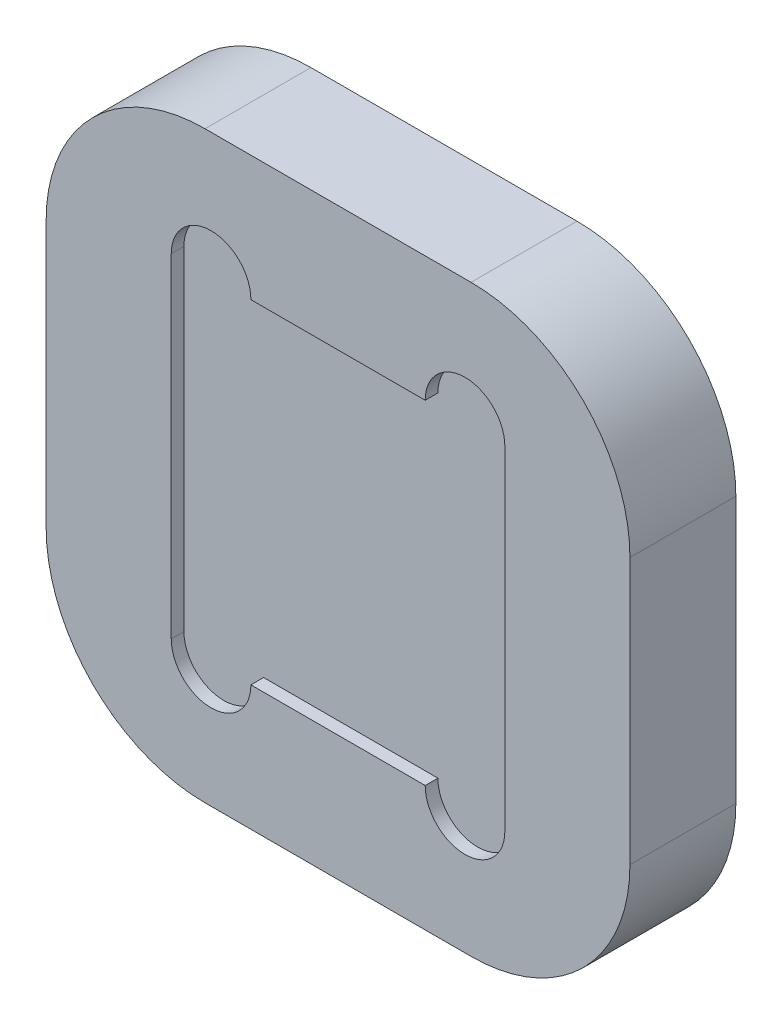
ISO-10303-21;
HEADER;
FILE_DESCRIPTION(('STEP AP214'),'2;1');
FILE_NAME('part.step','',(''),(''),'','','');
FILE_SCHEMA(('AUTOMOTIVE_DESIGN { 1 0 10303 214 1 1 1 1 }'));
ENDSEC;
DATA;
#1=APPLICATION_CONTEXT('core data for automotive mechanical design processes');
#2=APPLICATION_PROTOCOL_DEFINITION('international standard','automotive_design',2000,#1);
#3=PRODUCT_CONTEXT('',#1,'mechanical');
#4=PRODUCT('Part','Part','',(#3));
#5=PRODUCT_RELATED_PRODUCT_CATEGORY('part','',(#4));
#6=PRODUCT_DEFINITION_FORMATION('','',#4);
#7=PRODUCT_DEFINITION_CONTEXT('part definition',#1,'design');
#8=PRODUCT_DEFINITION('design','',#6,#7);
#9=PRODUCT_DEFINITION_SHAPE('','',#8);
#10=(LENGTH_UNIT() NAMED_UNIT(*) SI_UNIT(.MILLI.,.METRE.));
#11=(NAMED_UNIT(*) PLANE_ANGLE_UNIT() SI_UNIT($,.RADIAN.));
#12=(NAMED_UNIT(*) SI_UNIT($,.STERADIAN.) SOLID_ANGLE_UNIT());
#13=UNCERTAINTY_MEASURE_WITH_UNIT(LENGTH_MEASURE(1.E-05),#10,'distance_accuracy_value','');
#14=(GEOMETRIC_REPRESENTATION_CONTEXT(3) GLOBAL_UNCERTAINTY_ASSIGNED_CONTEXT((#13)) GLOBAL_UNIT_ASSIGNED_CONTEXT((#10,
#11,#12)) REPRESENTATION_CONTEXT('',''));
#15=CARTESIAN_POINT('',(0.,0.,0.));
#16=DIRECTION('',(0.,0.,1.));
#17=DIRECTION('',(1.,0.,0.));
#18=AXIS2_PLACEMENT_3D('',#15,#16,#17);
#19=CARTESIAN_POINT('',(17.5,17.5,6.35));
#20=DIRECTION('',(-1.,0.,0.));
#21=DIRECTION('',(0.,-1.,0.));
#22=AXIS2_PLACEMENT_3D('',#19,#20,#21);
#23=PLANE('',#22);
#24=DIRECTION('',(0.,1.,0.));
#25=VECTOR('',#24,1.);
#26=CARTESIAN_POINT('',(17.5,17.5,0.));
#27=LINE('',#26,#25);
#28=CARTESIAN_POINT('',(17.5,-7.97500000000001,0.));
#29=VERTEX_POINT('',#28);
#30=CARTESIAN_POINT('',(17.5,7.975,0.));
#31=VERTEX_POINT('',#30);
#32=EDGE_CURVE('E210',#29,#31,#27,.T.);
#33=ORIENTED_EDGE('',*,*,#32,.T.);
#34=DIRECTION('',(0.,0.,-1.));
#35=VECTOR('',#34,1.);
#36=CARTESIAN_POINT('',(17.5,7.975,6.35));
#37=LINE('',#36,#35);
#38=CARTESIAN_POINT('',(17.5,7.975,6.35));
#39=VERTEX_POINT('',#38);
#40=EDGE_CURVE('E258',#31,#39,#37,.F.);
#41=ORIENTED_EDGE('',*,*,#40,.T.);
#42=DIRECTION('',(0.,1.,0.));
#43=VECTOR('',#42,1.);
#44=CARTESIAN_POINT('',(17.5,17.5,6.35));
#45=LINE('',#44,#43);
#46=CARTESIAN_POINT('',(17.5,-7.97500000000001,6.35));
#47=VERTEX_POINT('',#46);
#48=EDGE_CURVE('E222',#47,#39,#45,.T.);
#49=ORIENTED_EDGE('',*,*,#48,.F.);
#50=DIRECTION('',(0.,0.,-1.));
#51=VECTOR('',#50,1.);
#52=CARTESIAN_POINT('',(17.5,-7.97500000000001,6.35));
#53=LINE('',#52,#51);
#54=EDGE_CURVE('E255',#47,#29,#53,.T.);
#55=ORIENTED_EDGE('',*,*,#54,.T.);
#56=EDGE_LOOP('',(#33,#41,#49,#55));
#57=FACE_BOUND('',#56,.T.);
#58=ADVANCED_FACE('F32',(#57),#23,.F.);
#59=CARTESIAN_POINT('',(-17.5,17.5,6.35));
#60=DIRECTION('',(0.,-1.,0.));
#61=DIRECTION('',(0.,0.,-1.));
#62=AXIS2_PLACEMENT_3D('',#59,#60,#61);
#63=PLANE('',#62);
#64=DIRECTION('',(-1.,0.,0.));
#65=VECTOR('',#64,1.);
#66=CARTESIAN_POINT('',(-17.5,17.5,6.35));
#67=LINE('',#66,#65);
#68=CARTESIAN_POINT('',(7.975,17.5,6.35));
#69=VERTEX_POINT('',#68);
#70=CARTESIAN_POINT('',(-7.975,17.5,6.35));
#71=VERTEX_POINT('',#70);
#72=EDGE_CURVE('E225',#69,#71,#67,.T.);
#73=ORIENTED_EDGE('',*,*,#72,.F.);
#74=DIRECTION('',(0.,0.,-1.));
#75=VECTOR('',#74,1.);
#76=CARTESIAN_POINT('',(7.975,17.5,6.35));
#77=LINE('',#76,#75);
#78=CARTESIAN_POINT('',(7.975,17.5,0.));
#79=VERTEX_POINT('',#78);
#80=EDGE_CURVE('E244',#69,#79,#77,.T.);
#81=ORIENTED_EDGE('',*,*,#80,.T.);
#82=DIRECTION('',(-1.,0.,0.));
#83=VECTOR('',#82,1.);
#84=CARTESIAN_POINT('',(-17.5,17.5,0.));
#85=LINE('',#84,#83);
#86=CARTESIAN_POINT('',(-7.975,17.5,0.));
#87=VERTEX_POINT('',#86);
#88=EDGE_CURVE('E236',#79,#87,#85,.T.);
#89=ORIENTED_EDGE('',*,*,#88,.T.);
#90=DIRECTION('',(0.,0.,-1.));
#91=VECTOR('',#90,1.);
#92=CARTESIAN_POINT('',(-7.975,17.5,6.35));
#93=LINE('',#92,#91);
#94=EDGE_CURVE('E233',#87,#71,#93,.F.);
#95=ORIENTED_EDGE('',*,*,#94,.T.);
#96=EDGE_LOOP('',(#73,#81,#89,#95));
#97=FACE_BOUND('',#96,.T.);
#98=ADVANCED_FACE('F299',(#97),#63,.F.);
#99=CARTESIAN_POINT('',(-17.5,17.5,6.35));
#100=DIRECTION('',(1.,0.,0.));
#101=DIRECTION('',(0.,0.,-1.));
#102=AXIS2_PLACEMENT_3D('',#99,#100,#101);
#103=PLANE('',#102);
#104=DIRECTION('',(0.,-1.,0.));
#105=VECTOR('',#104,1.);
#106=CARTESIAN_POINT('',(-17.5,17.5,6.35));
#107=LINE('',#106,#105);
#108=CARTESIAN_POINT('',(-17.5,7.97499999999999,6.35));
#109=VERTEX_POINT('',#108);
#110=CARTESIAN_POINT('',(-17.5,-7.97500000000001,6.35));
#111=VERTEX_POINT('',#110);
#112=EDGE_CURVE('E229',#109,#111,#107,.T.);
#113=ORIENTED_EDGE('',*,*,#112,.F.);
#114=DIRECTION('',(0.,0.,-1.));
#115=VECTOR('',#114,1.);
#116=CARTESIAN_POINT('',(-17.5,7.97499999999999,6.35));
#117=LINE('',#116,#115);
#118=CARTESIAN_POINT('',(-17.5,7.97499999999999,0.));
#119=VERTEX_POINT('',#118);
#120=EDGE_CURVE('E11',#109,#119,#117,.T.);
#121=ORIENTED_EDGE('',*,*,#120,.T.);
#122=DIRECTION('',(0.,-1.,0.));
#123=VECTOR('',#122,1.);
#124=CARTESIAN_POINT('',(-17.5,17.5,0.));
#125=LINE('',#124,#123);
#126=CARTESIAN_POINT('',(-17.5,-7.97500000000001,0.));
#127=VERTEX_POINT('',#126);
#128=EDGE_CURVE('E239',#119,#127,#125,.T.);
#129=ORIENTED_EDGE('',*,*,#128,.T.);
#130=DIRECTION('',(0.,0.,-1.));
#131=VECTOR('',#130,1.);
#132=CARTESIAN_POINT('',(-17.5,-7.97500000000001,6.35));
#133=LINE('',#132,#131);
#134=EDGE_CURVE('E40',#127,#111,#133,.F.);
#135=ORIENTED_EDGE('',*,*,#134,.T.);
#136=EDGE_LOOP('',(#113,#121,#129,#135));
#137=FACE_BOUND('',#136,.T.);
#138=ADVANCED_FACE('F273',(#137),#103,.F.);
#139=CARTESIAN_POINT('',(-17.5,-17.5,6.35));
#140=DIRECTION('',(0.,1.,0.));
#141=DIRECTION('',(0.,0.,1.));
#142=AXIS2_PLACEMENT_3D('',#139,#140,#141);
#143=PLANE('',#142);
#144=DIRECTION('',(1.,0.,0.));
#145=VECTOR('',#144,1.);
#146=CARTESIAN_POINT('',(-17.5,-17.5,0.));
#147=LINE('',#146,#145);
#148=CARTESIAN_POINT('',(-7.975,-17.5,0.));
#149=VERTEX_POINT('',#148);
#150=CARTESIAN_POINT('',(7.975,-17.5,0.));
#151=VERTEX_POINT('',#150);
#152=EDGE_CURVE('E226',#149,#151,#147,.T.);
#153=ORIENTED_EDGE('',*,*,#152,.T.);
#154=DIRECTION('',(0.,0.,-1.));
#155=VECTOR('',#154,1.);
#156=CARTESIAN_POINT('',(7.975,-17.5,6.35));
#157=LINE('',#156,#155);
#158=CARTESIAN_POINT('',(7.975,-17.5,6.35));
#159=VERTEX_POINT('',#158);
#160=EDGE_CURVE('E47',#151,#159,#157,.F.);
#161=ORIENTED_EDGE('',*,*,#160,.T.);
#162=DIRECTION('',(1.,0.,0.));
#163=VECTOR('',#162,1.);
#164=CARTESIAN_POINT('',(-17.5,-17.5,6.35));
#165=LINE('',#164,#163);
#166=CARTESIAN_POINT('',(-7.975,-17.5,6.35));
#167=VERTEX_POINT('',#166);
#168=EDGE_CURVE('E231',#167,#159,#165,.T.);
#169=ORIENTED_EDGE('',*,*,#168,.F.);
#170=DIRECTION('',(0.,0.,-1.));
#171=VECTOR('',#170,1.);
#172=CARTESIAN_POINT('',(-7.975,-17.5,6.35));
#173=LINE('',#172,#171);
#174=EDGE_CURVE('E267',#167,#149,#173,.T.);
#175=ORIENTED_EDGE('',*,*,#174,.T.);
#176=EDGE_LOOP('',(#153,#161,#169,#175));
#177=FACE_BOUND('',#176,.T.);
#178=ADVANCED_FACE('F281',(#177),#143,.F.);
#179=CARTESIAN_POINT('',(0.,0.,6.35));
#180=DIRECTION('',(0.,0.,1.));
#181=DIRECTION('',(1.,0.,0.));
#182=AXIS2_PLACEMENT_3D('',#179,#180,#181);
#183=PLANE('',#182);
#184=CARTESIAN_POINT('',(-7.61239999999999,10.,6.35));
#185=DIRECTION('',(0.,0.,1.));
#186=DIRECTION('',(1.,0.,0.));
#187=AXIS2_PLACEMENT_3D('',#184,#185,#186);
#188=CIRCLE('',#187,2.3876);
#189=CARTESIAN_POINT('',(-5.22479999999999,10.,6.35));
#190=VERTEX_POINT('',#189);
#191=CARTESIAN_POINT('',(-10.,10.,6.35));
#192=VERTEX_POINT('',#191);
#193=EDGE_CURVE('E154',#190,#192,#188,.T.);
#194=ORIENTED_EDGE('',*,*,#193,.F.);
#195=DIRECTION('',(-1.,0.,0.));
#196=VECTOR('',#195,1.);
#197=CARTESIAN_POINT('',(-5.22479999999999,10.,6.35));
#198=LINE('',#197,#196);
#199=CARTESIAN_POINT('',(5.2248,10.,6.35));
#200=VERTEX_POINT('',#199);
#201=EDGE_CURVE('E172',#200,#190,#198,.T.);
#202=ORIENTED_EDGE('',*,*,#201,.F.);
#203=CARTESIAN_POINT('',(7.6124,10.,6.35));
#204=DIRECTION('',(0.,0.,1.));
#205=DIRECTION('',(1.,0.,0.));
#206=AXIS2_PLACEMENT_3D('',#203,#204,#205);
#207=CIRCLE('',#206,2.3876);
#208=CARTESIAN_POINT('',(10.,10.,6.35));
#209=VERTEX_POINT('',#208);
#210=EDGE_CURVE('E175',#209,#200,#207,.T.);
#211=ORIENTED_EDGE('',*,*,#210,.F.);
#212=DIRECTION('',(0.,1.,0.));
#213=VECTOR('',#212,1.);
#214=CARTESIAN_POINT('',(10.,10.,6.35));
#215=LINE('',#214,#213);
#216=CARTESIAN_POINT('',(10.,-10.,6.35));
#217=VERTEX_POINT('',#216);
#218=EDGE_CURVE('E203',#217,#209,#215,.T.);
#219=ORIENTED_EDGE('',*,*,#218,.F.);
#220=CARTESIAN_POINT('',(7.6124,-10.,6.35));
#221=DIRECTION('',(0.,0.,1.));
#222=DIRECTION('',(1.,0.,0.));
#223=AXIS2_PLACEMENT_3D('',#220,#221,#222);
#224=CIRCLE('',#223,2.3876);
#225=CARTESIAN_POINT('',(5.2248,-10.,6.35));
#226=VERTEX_POINT('',#225);
#227=EDGE_CURVE('E200',#226,#217,#224,.T.);
#228=ORIENTED_EDGE('',*,*,#227,.F.);
#229=DIRECTION('',(1.,0.,0.));
#230=VECTOR('',#229,1.);
#231=CARTESIAN_POINT('',(-5.22479999999999,-10.,6.35));
#232=LINE('',#231,#230);
#233=CARTESIAN_POINT('',(-5.22479999999999,-10.,6.35));
#234=VERTEX_POINT('',#233);
#235=EDGE_CURVE('E197',#234,#226,#232,.T.);
#236=ORIENTED_EDGE('',*,*,#235,.F.);
#237=CARTESIAN_POINT('',(-7.61239999999999,-10.,6.35));
#238=DIRECTION('',(0.,0.,1.));
#239=DIRECTION('',(1.,0.,0.));
#240=AXIS2_PLACEMENT_3D('',#237,#238,#239);
#241=CIRCLE('',#240,2.3876);
#242=CARTESIAN_POINT('',(-10.,-10.,6.35));
#243=VERTEX_POINT('',#242);
#244=EDGE_CURVE('E194',#243,#234,#241,.T.);
#245=ORIENTED_EDGE('',*,*,#244,.F.);
#246=DIRECTION('',(0.,-1.,0.));
#247=VECTOR('',#246,1.);
#248=CARTESIAN_POINT('',(-10.,10.,6.35));
#249=LINE('',#248,#247);
#250=EDGE_CURVE('E192',#192,#243,#249,.T.);
#251=ORIENTED_EDGE('',*,*,#250,.F.);
#252=EDGE_LOOP('',(#194,#202,#211,#219,#228,#236,#245,#251));
#253=FACE_BOUND('',#252,.T.);
#254=ORIENTED_EDGE('',*,*,#48,.T.);
#255=CARTESIAN_POINT('',(7.975,7.97499999999999,6.35));
#256=DIRECTION('',(0.,0.,1.));
#257=DIRECTION('',(1.,0.,0.));
#258=AXIS2_PLACEMENT_3D('',#255,#256,#257);
#259=CIRCLE('',#258,9.525);
#260=EDGE_CURVE('E265',#39,#69,#259,.T.);
#261=ORIENTED_EDGE('',*,*,#260,.T.);
#262=ORIENTED_EDGE('',*,*,#72,.T.);
#263=CARTESIAN_POINT('',(-7.975,7.97499999999999,6.35));
#264=DIRECTION('',(0.,0.,1.));
#265=DIRECTION('',(1.,0.,0.));
#266=AXIS2_PLACEMENT_3D('',#263,#264,#265);
#267=CIRCLE('',#266,9.525);
#268=EDGE_CURVE('E261',#71,#109,#267,.T.);
#269=ORIENTED_EDGE('',*,*,#268,.T.);
#270=ORIENTED_EDGE('',*,*,#112,.T.);
#271=CARTESIAN_POINT('',(-7.975,-7.97500000000001,6.35));
#272=DIRECTION('',(0.,0.,1.));
#273=DIRECTION('',(1.,0.,0.));
#274=AXIS2_PLACEMENT_3D('',#271,#272,#273);
#275=CIRCLE('',#274,9.525);
#276=EDGE_CURVE('E54',#111,#167,#275,.T.);
#277=ORIENTED_EDGE('',*,*,#276,.T.);
#278=ORIENTED_EDGE('',*,*,#168,.T.);
#279=CARTESIAN_POINT('',(7.975,-7.97500000000001,6.35));
#280=DIRECTION('',(0.,0.,1.));
#281=DIRECTION('',(1.,0.,0.));
#282=AXIS2_PLACEMENT_3D('',#279,#280,#281);
#283=CIRCLE('',#282,9.525);
#284=EDGE_CURVE('E263',#159,#47,#283,.T.);
#285=ORIENTED_EDGE('',*,*,#284,.T.);
#286=EDGE_LOOP('',(#254,#261,#262,#269,#270,#277,#278,#285));
#287=FACE_BOUND('',#286,.T.);
#288=ADVANCED_FACE('F277',(#253,#287),#183,.T.);
#289=CARTESIAN_POINT('',(0.,0.,0.));
#290=DIRECTION('',(0.,0.,1.));
#291=DIRECTION('',(1.,0.,0.));
#292=AXIS2_PLACEMENT_3D('',#289,#290,#291);
#293=PLANE('',#292);
#294=ORIENTED_EDGE('',*,*,#88,.F.);
#295=CARTESIAN_POINT('',(7.975,7.97499999999999,0.));
#296=DIRECTION('',(0.,0.,1.));
#297=DIRECTION('',(1.,0.,0.));
#298=AXIS2_PLACEMENT_3D('',#295,#296,#297);
#299=CIRCLE('',#298,9.525);
#300=EDGE_CURVE('E253',#79,#31,#299,.F.);
#301=ORIENTED_EDGE('',*,*,#300,.T.);
#302=ORIENTED_EDGE('',*,*,#32,.F.);
#303=CARTESIAN_POINT('',(7.975,-7.97500000000001,0.));
#304=DIRECTION('',(0.,0.,1.));
#305=DIRECTION('',(1.,0.,0.));
#306=AXIS2_PLACEMENT_3D('',#303,#304,#305);
#307=CIRCLE('',#306,9.525);
#308=EDGE_CURVE('E251',#29,#151,#307,.F.);
#309=ORIENTED_EDGE('',*,*,#308,.T.);
#310=ORIENTED_EDGE('',*,*,#152,.F.);
#311=CARTESIAN_POINT('',(-7.975,-7.97500000000001,0.));
#312=DIRECTION('',(0.,0.,1.));
#313=DIRECTION('',(1.,0.,0.));
#314=AXIS2_PLACEMENT_3D('',#311,#312,#313);
#315=CIRCLE('',#314,9.525);
#316=EDGE_CURVE('E247',#149,#127,#315,.F.);
#317=ORIENTED_EDGE('',*,*,#316,.T.);
#318=ORIENTED_EDGE('',*,*,#128,.F.);
#319=CARTESIAN_POINT('',(-7.975,7.97499999999999,0.));
#320=DIRECTION('',(0.,0.,1.));
#321=DIRECTION('',(1.,0.,0.));
#322=AXIS2_PLACEMENT_3D('',#319,#320,#321);
#323=CIRCLE('',#322,9.525);
#324=EDGE_CURVE('E249',#119,#87,#323,.F.);
#325=ORIENTED_EDGE('',*,*,#324,.T.);
#326=EDGE_LOOP('',(#294,#301,#302,#309,#310,#317,#318,#325));
#327=FACE_BOUND('',#326,.T.);
#328=ADVANCED_FACE('F284',(#327),#293,.F.);
#329=CARTESIAN_POINT('',(-7.61239999999999,10.,5.588));
#330=DIRECTION('',(0.,0.,1.));
#331=DIRECTION('',(1.,0.,0.));
#332=AXIS2_PLACEMENT_3D('',#329,#330,#331);
#333=CYLINDRICAL_SURFACE('',#332,2.3876);
#334=ORIENTED_EDGE('',*,*,#193,.T.);
#335=DIRECTION('',(0.,0.,1.));
#336=VECTOR('',#335,1.);
#337=CARTESIAN_POINT('',(-10.,10.,5.588));
#338=LINE('',#337,#336);
#339=CARTESIAN_POINT('',(-10.,10.,5.588));
#340=VERTEX_POINT('',#339);
#341=EDGE_CURVE('E147',#340,#192,#338,.T.);
#342=ORIENTED_EDGE('',*,*,#341,.F.);
#343=CARTESIAN_POINT('',(-7.61239999999999,10.,5.588));
#344=DIRECTION('',(0.,0.,1.));
#345=DIRECTION('',(1.,0.,0.));
#346=AXIS2_PLACEMENT_3D('',#343,#344,#345);
#347=CIRCLE('',#346,2.3876);
#348=CARTESIAN_POINT('',(-5.22479999999999,10.,5.588));
#349=VERTEX_POINT('',#348);
#350=EDGE_CURVE('E151',#349,#340,#347,.T.);
#351=ORIENTED_EDGE('',*,*,#350,.F.);
#352=DIRECTION('',(0.,0.,1.));
#353=VECTOR('',#352,1.);
#354=CARTESIAN_POINT('',(-5.22479999999999,10.,5.588));
#355=LINE('',#354,#353);
#356=EDGE_CURVE('E208',#349,#190,#355,.T.);
#357=ORIENTED_EDGE('',*,*,#356,.T.);
#358=EDGE_LOOP('',(#334,#342,#351,#357));
#359=FACE_BOUND('',#358,.T.);
#360=ADVANCED_FACE('F149',(#359),#333,.F.);
#361=CARTESIAN_POINT('',(-5.22479999999999,10.,5.588));
#362=DIRECTION('',(0.,1.,0.));
#363=DIRECTION('',(0.,0.,1.));
#364=AXIS2_PLACEMENT_3D('',#361,#362,#363);
#365=PLANE('',#364);
#366=ORIENTED_EDGE('',*,*,#201,.T.);
#367=ORIENTED_EDGE('',*,*,#356,.F.);
#368=DIRECTION('',(-1.,0.,0.));
#369=VECTOR('',#368,1.);
#370=CARTESIAN_POINT('',(-5.22479999999999,10.,5.588));
#371=LINE('',#370,#369);
#372=CARTESIAN_POINT('',(5.2248,10.,5.588));
#373=VERTEX_POINT('',#372);
#374=EDGE_CURVE('E159',#373,#349,#371,.T.);
#375=ORIENTED_EDGE('',*,*,#374,.F.);
#376=DIRECTION('',(0.,0.,1.));
#377=VECTOR('',#376,1.);
#378=CARTESIAN_POINT('',(5.2248,10.,5.588));
#379=LINE('',#378,#377);
#380=EDGE_CURVE('E211',#373,#200,#379,.T.);
#381=ORIENTED_EDGE('',*,*,#380,.T.);
#382=EDGE_LOOP('',(#366,#367,#375,#381));
#383=FACE_BOUND('',#382,.T.);
#384=ADVANCED_FACE('F328',(#383),#365,.F.);
#385=CARTESIAN_POINT('',(7.6124,10.,5.588));
#386=DIRECTION('',(0.,0.,1.));
#387=DIRECTION('',(1.,0.,0.));
#388=AXIS2_PLACEMENT_3D('',#385,#386,#387);
#389=CYLINDRICAL_SURFACE('',#388,2.3876);
#390=ORIENTED_EDGE('',*,*,#210,.T.);
#391=ORIENTED_EDGE('',*,*,#380,.F.);
#392=CARTESIAN_POINT('',(7.6124,10.,5.588));
#393=DIRECTION('',(0.,0.,1.));
#394=DIRECTION('',(1.,0.,0.));
#395=AXIS2_PLACEMENT_3D('',#392,#393,#394);
#396=CIRCLE('',#395,2.3876);
#397=CARTESIAN_POINT('',(10.,10.,5.588));
#398=VERTEX_POINT('',#397);
#399=EDGE_CURVE('E188',#398,#373,#396,.T.);
#400=ORIENTED_EDGE('',*,*,#399,.F.);
#401=DIRECTION('',(0.,0.,1.));
#402=VECTOR('',#401,1.);
#403=CARTESIAN_POINT('',(10.,10.,5.588));
#404=LINE('',#403,#402);
#405=EDGE_CURVE('E213',#398,#209,#404,.T.);
#406=ORIENTED_EDGE('',*,*,#405,.T.);
#407=EDGE_LOOP('',(#390,#391,#400,#406));
#408=FACE_BOUND('',#407,.T.);
#409=ADVANCED_FACE('F331',(#408),#389,.F.);
#410=CARTESIAN_POINT('',(10.,10.,5.588));
#411=DIRECTION('',(1.,0.,0.));
#412=DIRECTION('',(0.,1.,0.));
#413=AXIS2_PLACEMENT_3D('',#410,#411,#412);
#414=PLANE('',#413);
#415=ORIENTED_EDGE('',*,*,#218,.T.);
#416=ORIENTED_EDGE('',*,*,#405,.F.);
#417=DIRECTION('',(0.,1.,0.));
#418=VECTOR('',#417,1.);
#419=CARTESIAN_POINT('',(10.,10.,5.588));
#420=LINE('',#419,#418);
#421=CARTESIAN_POINT('',(10.,-10.,5.588));
#422=VERTEX_POINT('',#421);
#423=EDGE_CURVE('E185',#422,#398,#420,.T.);
#424=ORIENTED_EDGE('',*,*,#423,.F.);
#425=DIRECTION('',(0.,0.,1.));
#426=VECTOR('',#425,1.);
#427=CARTESIAN_POINT('',(10.,-10.,5.588));
#428=LINE('',#427,#426);
#429=EDGE_CURVE('E215',#422,#217,#428,.T.);
#430=ORIENTED_EDGE('',*,*,#429,.T.);
#431=EDGE_LOOP('',(#415,#416,#424,#430));
#432=FACE_BOUND('',#431,.T.);
#433=ADVANCED_FACE('F335',(#432),#414,.F.);
#434=CARTESIAN_POINT('',(7.6124,-10.,5.588));
#435=DIRECTION('',(0.,0.,1.));
#436=DIRECTION('',(1.,0.,0.));
#437=AXIS2_PLACEMENT_3D('',#434,#435,#436);
#438=CYLINDRICAL_SURFACE('',#437,2.3876);
#439=ORIENTED_EDGE('',*,*,#227,.T.);
#440=ORIENTED_EDGE('',*,*,#429,.F.);
#441=CARTESIAN_POINT('',(7.6124,-10.,5.588));
#442=DIRECTION('',(0.,0.,1.));
#443=DIRECTION('',(1.,0.,0.));
#444=AXIS2_PLACEMENT_3D('',#441,#442,#443);
#445=CIRCLE('',#444,2.3876);
#446=CARTESIAN_POINT('',(5.2248,-10.,5.588));
#447=VERTEX_POINT('',#446);
#448=EDGE_CURVE('E182',#447,#422,#445,.T.);
#449=ORIENTED_EDGE('',*,*,#448,.F.);
#450=DIRECTION('',(0.,0.,1.));
#451=VECTOR('',#450,1.);
#452=CARTESIAN_POINT('',(5.2248,-10.,5.588));
#453=LINE('',#452,#451);
#454=EDGE_CURVE('E217',#447,#226,#453,.T.);
#455=ORIENTED_EDGE('',*,*,#454,.T.);
#456=EDGE_LOOP('',(#439,#440,#449,#455));
#457=FACE_BOUND('',#456,.T.);
#458=ADVANCED_FACE('F339',(#457),#438,.F.);
#459=CARTESIAN_POINT('',(-5.22479999999999,-10.,5.588));
#460=DIRECTION('',(0.,-1.,0.));
#461=DIRECTION('',(0.,0.,-1.));
#462=AXIS2_PLACEMENT_3D('',#459,#460,#461);
#463=PLANE('',#462);
#464=ORIENTED_EDGE('',*,*,#235,.T.);
#465=ORIENTED_EDGE('',*,*,#454,.F.);
#466=DIRECTION('',(1.,0.,0.));
#467=VECTOR('',#466,1.);
#468=CARTESIAN_POINT('',(-5.22479999999999,-10.,5.588));
#469=LINE('',#468,#467);
#470=CARTESIAN_POINT('',(-5.22479999999999,-10.,5.588));
#471=VERTEX_POINT('',#470);
#472=EDGE_CURVE('E179',#471,#447,#469,.T.);
#473=ORIENTED_EDGE('',*,*,#472,.F.);
#474=DIRECTION('',(0.,0.,1.));
#475=VECTOR('',#474,1.);
#476=CARTESIAN_POINT('',(-5.22479999999999,-10.,5.588));
#477=LINE('',#476,#475);
#478=EDGE_CURVE('E219',#471,#234,#477,.T.);
#479=ORIENTED_EDGE('',*,*,#478,.T.);
#480=EDGE_LOOP('',(#464,#465,#473,#479));
#481=FACE_BOUND('',#480,.T.);
#482=ADVANCED_FACE('F343',(#481),#463,.F.);
#483=CARTESIAN_POINT('',(-7.61239999999999,-10.,5.588));
#484=DIRECTION('',(0.,0.,1.));
#485=DIRECTION('',(1.,0.,0.));
#486=AXIS2_PLACEMENT_3D('',#483,#484,#485);
#487=CYLINDRICAL_SURFACE('',#486,2.3876);
#488=ORIENTED_EDGE('',*,*,#244,.T.);
#489=ORIENTED_EDGE('',*,*,#478,.F.);
#490=CARTESIAN_POINT('',(-7.61239999999999,-10.,5.588));
#491=DIRECTION('',(0.,0.,1.));
#492=DIRECTION('',(1.,0.,0.));
#493=AXIS2_PLACEMENT_3D('',#490,#491,#492);
#494=CIRCLE('',#493,2.3876);
#495=CARTESIAN_POINT('',(-10.,-10.,5.588));
#496=VERTEX_POINT('',#495);
#497=EDGE_CURVE('E167',#496,#471,#494,.T.);
#498=ORIENTED_EDGE('',*,*,#497,.F.);
#499=DIRECTION('',(0.,0.,1.));
#500=VECTOR('',#499,1.);
#501=CARTESIAN_POINT('',(-10.,-10.,5.588));
#502=LINE('',#501,#500);
#503=EDGE_CURVE('E158',#496,#243,#502,.T.);
#504=ORIENTED_EDGE('',*,*,#503,.T.);
#505=EDGE_LOOP('',(#488,#489,#498,#504));
#506=FACE_BOUND('',#505,.T.);
#507=ADVANCED_FACE('F325',(#506),#487,.F.);
#508=CARTESIAN_POINT('',(-10.,10.,5.588));
#509=DIRECTION('',(-1.,0.,0.));
#510=DIRECTION('',(0.,-1.,0.));
#511=AXIS2_PLACEMENT_3D('',#508,#509,#510);
#512=PLANE('',#511);
#513=ORIENTED_EDGE('',*,*,#250,.T.);
#514=ORIENTED_EDGE('',*,*,#503,.F.);
#515=DIRECTION('',(0.,-1.,0.));
#516=VECTOR('',#515,1.);
#517=CARTESIAN_POINT('',(-10.,10.,5.588));
#518=LINE('',#517,#516);
#519=EDGE_CURVE('E162',#340,#496,#518,.T.);
#520=ORIENTED_EDGE('',*,*,#519,.F.);
#521=ORIENTED_EDGE('',*,*,#341,.T.);
#522=EDGE_LOOP('',(#513,#514,#520,#521));
#523=FACE_BOUND('',#522,.T.);
#524=ADVANCED_FACE('F163',(#523),#512,.F.);
#525=CARTESIAN_POINT('',(-7.61239999999999,10.,5.588));
#526=DIRECTION('',(0.,0.,1.));
#527=DIRECTION('',(1.,0.,0.));
#528=AXIS2_PLACEMENT_3D('',#525,#526,#527);
#529=PLANE('',#528);
#530=ORIENTED_EDGE('',*,*,#350,.T.);
#531=ORIENTED_EDGE('',*,*,#519,.T.);
#532=ORIENTED_EDGE('',*,*,#497,.T.);
#533=ORIENTED_EDGE('',*,*,#472,.T.);
#534=ORIENTED_EDGE('',*,*,#448,.T.);
#535=ORIENTED_EDGE('',*,*,#423,.T.);
#536=ORIENTED_EDGE('',*,*,#399,.T.);
#537=ORIENTED_EDGE('',*,*,#374,.T.);
#538=EDGE_LOOP('',(#530,#531,#532,#533,#534,#535,#536,#537));
#539=FACE_BOUND('',#538,.T.);
#540=ADVANCED_FACE('F169',(#539),#529,.T.);
#541=CARTESIAN_POINT('',(7.975,7.97499999999999,6.35));
#542=DIRECTION('',(0.,0.,-1.));
#543=DIRECTION('',(-1.,0.,0.));
#544=AXIS2_PLACEMENT_3D('',#541,#542,#543);
#545=CYLINDRICAL_SURFACE('',#544,9.525);
#546=ORIENTED_EDGE('',*,*,#260,.F.);
#547=ORIENTED_EDGE('',*,*,#40,.F.);
#548=ORIENTED_EDGE('',*,*,#300,.F.);
#549=ORIENTED_EDGE('',*,*,#80,.F.);
#550=EDGE_LOOP('',(#546,#547,#548,#549));
#551=FACE_BOUND('',#550,.T.);
#552=ADVANCED_FACE('F297',(#551),#545,.T.);
#553=CARTESIAN_POINT('',(7.975,-7.97500000000001,6.35));
#554=DIRECTION('',(0.,0.,-1.));
#555=DIRECTION('',(-1.,0.,0.));
#556=AXIS2_PLACEMENT_3D('',#553,#554,#555);
#557=CYLINDRICAL_SURFACE('',#556,9.525);
#558=ORIENTED_EDGE('',*,*,#284,.F.);
#559=ORIENTED_EDGE('',*,*,#160,.F.);
#560=ORIENTED_EDGE('',*,*,#308,.F.);
#561=ORIENTED_EDGE('',*,*,#54,.F.);
#562=EDGE_LOOP('',(#558,#559,#560,#561));
#563=FACE_BOUND('',#562,.T.);
#564=ADVANCED_FACE('F289',(#563),#557,.T.);
#565=CARTESIAN_POINT('',(-7.975,7.97499999999999,6.35));
#566=DIRECTION('',(0.,0.,-1.));
#567=DIRECTION('',(-1.,0.,0.));
#568=AXIS2_PLACEMENT_3D('',#565,#566,#567);
#569=CYLINDRICAL_SURFACE('',#568,9.525);
#570=ORIENTED_EDGE('',*,*,#268,.F.);
#571=ORIENTED_EDGE('',*,*,#94,.F.);
#572=ORIENTED_EDGE('',*,*,#324,.F.);
#573=ORIENTED_EDGE('',*,*,#120,.F.);
#574=EDGE_LOOP('',(#570,#571,#572,#573));
#575=FACE_BOUND('',#574,.T.);
#576=ADVANCED_FACE('F302',(#575),#569,.T.);
#577=CARTESIAN_POINT('',(-7.975,-7.97500000000001,6.35));
#578=DIRECTION('',(0.,0.,-1.));
#579=DIRECTION('',(-1.,0.,0.));
#580=AXIS2_PLACEMENT_3D('',#577,#578,#579);
#581=CYLINDRICAL_SURFACE('',#580,9.525);
#582=ORIENTED_EDGE('',*,*,#276,.F.);
#583=ORIENTED_EDGE('',*,*,#134,.F.);
#584=ORIENTED_EDGE('',*,*,#316,.F.);
#585=ORIENTED_EDGE('',*,*,#174,.F.);
#586=EDGE_LOOP('',(#582,#583,#584,#585));
#587=FACE_BOUND('',#586,.T.);
#588=ADVANCED_FACE('F34',(#587),#581,.T.);
#589=CLOSED_SHELL('',(#58,#98,#138,#178,#288,#328,#360,#384,#409,#433,#458,#482,#507,#524,#540,
#552,#564,#576,#588));
#590=MANIFOLD_SOLID_BREP('B2',#589);
#591=ADVANCED_BREP_SHAPE_REPRESENTATION('',(#18,#590),#14);
#592=SHAPE_DEFINITION_REPRESENTATION(#9,#591);
ENDSEC;
END-ISO-10303-21;
